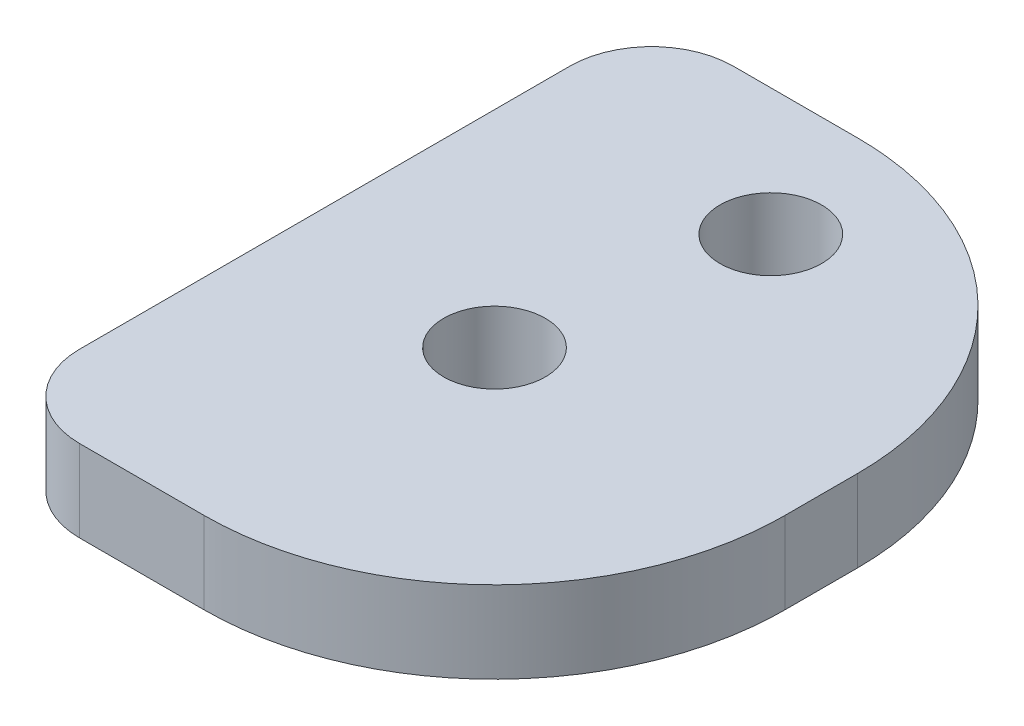
ISO-10303-21;
HEADER;
FILE_DESCRIPTION(('STEP AP214'),'2;1');
FILE_NAME('part.step','',(''),(''),'','','');
FILE_SCHEMA(('AUTOMOTIVE_DESIGN { 1 0 10303 214 1 1 1 1 }'));
ENDSEC;
DATA;
#1=APPLICATION_CONTEXT('core data for automotive mechanical design processes');
#2=APPLICATION_PROTOCOL_DEFINITION('international standard','automotive_design',2000,#1);
#3=PRODUCT_CONTEXT('',#1,'mechanical');
#4=PRODUCT('Part','Part','',(#3));
#5=PRODUCT_RELATED_PRODUCT_CATEGORY('part','',(#4));
#6=PRODUCT_DEFINITION_FORMATION('','',#4);
#7=PRODUCT_DEFINITION_CONTEXT('part definition',#1,'design');
#8=PRODUCT_DEFINITION('design','',#6,#7);
#9=PRODUCT_DEFINITION_SHAPE('','',#8);
#10=(LENGTH_UNIT() NAMED_UNIT(*) SI_UNIT(.MILLI.,.METRE.));
#11=(NAMED_UNIT(*) PLANE_ANGLE_UNIT() SI_UNIT($,.RADIAN.));
#12=(NAMED_UNIT(*) SI_UNIT($,.STERADIAN.) SOLID_ANGLE_UNIT());
#13=UNCERTAINTY_MEASURE_WITH_UNIT(LENGTH_MEASURE(1.E-05),#10,'distance_accuracy_value','');
#14=(GEOMETRIC_REPRESENTATION_CONTEXT(3) GLOBAL_UNCERTAINTY_ASSIGNED_CONTEXT((#13)) GLOBAL_UNIT_ASSIGNED_CONTEXT((#10,
#11,#12)) REPRESENTATION_CONTEXT('',''));
#15=CARTESIAN_POINT('',(0.,0.,0.));
#16=DIRECTION('',(0.,0.,1.));
#17=DIRECTION('',(1.,0.,0.));
#18=AXIS2_PLACEMENT_3D('',#15,#16,#17);
#19=CARTESIAN_POINT('',(-28.1645987316005,3.175,12.682633462926));
#20=DIRECTION('',(0.,0.,-1.));
#21=DIRECTION('',(-1.,0.,0.));
#22=AXIS2_PLACEMENT_3D('',#19,#20,#21);
#23=PLANE('',#22);
#24=DIRECTION('',(1.,0.,0.));
#25=VECTOR('',#24,1.);
#26=CARTESIAN_POINT('',(-28.1645987316005,3.175,12.682633462926));
#27=LINE('',#26,#25);
#28=CARTESIAN_POINT('',(12.1198036589627,3.175,12.682633462926));
#29=VERTEX_POINT('',#28);
#30=CARTESIAN_POINT('',(16.9458012683995,3.175,12.682633462926));
#31=VERTEX_POINT('',#30);
#32=EDGE_CURVE('E108',#29,#31,#27,.T.);
#33=ORIENTED_EDGE('',*,*,#32,.F.);
#34=DIRECTION('',(0.,1.,0.));
#35=VECTOR('',#34,1.);
#36=CARTESIAN_POINT('',(12.1198036589627,0.,12.682633462926));
#37=LINE('',#36,#35);
#38=CARTESIAN_POINT('',(12.1198036589627,0.,12.682633462926));
#39=VERTEX_POINT('',#38);
#40=EDGE_CURVE('E57',#29,#39,#37,.F.);
#41=ORIENTED_EDGE('',*,*,#40,.T.);
#42=DIRECTION('',(1.,0.,0.));
#43=VECTOR('',#42,1.);
#44=CARTESIAN_POINT('',(-28.1645987316005,0.,12.682633462926));
#45=LINE('',#44,#43);
#46=CARTESIAN_POINT('',(16.9458012683995,0.,12.682633462926));
#47=VERTEX_POINT('',#46);
#48=EDGE_CURVE('E151',#39,#47,#45,.T.);
#49=ORIENTED_EDGE('',*,*,#48,.T.);
#50=DIRECTION('',(0.,-1.,0.));
#51=VECTOR('',#50,1.);
#52=CARTESIAN_POINT('',(16.9458012683995,3.175,12.682633462926));
#53=LINE('',#52,#51);
#54=EDGE_CURVE('E162',#47,#31,#53,.F.);
#55=ORIENTED_EDGE('',*,*,#54,.T.);
#56=EDGE_LOOP('',(#33,#41,#49,#55));
#57=FACE_BOUND('',#56,.T.);
#58=ADVANCED_FACE('F34',(#57),#23,.F.);
#59=CARTESIAN_POINT('',(-28.1645987316005,3.175,-12.691966537074));
#60=DIRECTION('',(0.,0.,1.));
#61=DIRECTION('',(1.,0.,0.));
#62=AXIS2_PLACEMENT_3D('',#59,#60,#61);
#63=PLANE('',#62);
#64=DIRECTION('',(-1.,0.,0.));
#65=VECTOR('',#64,1.);
#66=CARTESIAN_POINT('',(-28.1645987316005,0.,-12.691966537074));
#67=LINE('',#66,#65);
#68=CARTESIAN_POINT('',(16.9458012683995,0.,-12.691966537074));
#69=VERTEX_POINT('',#68);
#70=CARTESIAN_POINT('',(12.1198036589627,0.,-12.691966537074));
#71=VERTEX_POINT('',#70);
#72=EDGE_CURVE('E163',#69,#71,#67,.T.);
#73=ORIENTED_EDGE('',*,*,#72,.T.);
#74=DIRECTION('',(0.,1.,0.));
#75=VECTOR('',#74,1.);
#76=CARTESIAN_POINT('',(12.1198036589627,3.175,-12.691966537074));
#77=LINE('',#76,#75);
#78=CARTESIAN_POINT('',(12.1198036589627,3.175,-12.691966537074));
#79=VERTEX_POINT('',#78);
#80=EDGE_CURVE('E11',#71,#79,#77,.T.);
#81=ORIENTED_EDGE('',*,*,#80,.T.);
#82=DIRECTION('',(-1.,0.,0.));
#83=VECTOR('',#82,1.);
#84=CARTESIAN_POINT('',(-28.1645987316005,3.175,-12.691966537074));
#85=LINE('',#84,#83);
#86=CARTESIAN_POINT('',(16.9458012683995,3.175,-12.691966537074));
#87=VERTEX_POINT('',#86);
#88=EDGE_CURVE('E123',#87,#79,#85,.T.);
#89=ORIENTED_EDGE('',*,*,#88,.F.);
#90=DIRECTION('',(0.,-1.,0.));
#91=VECTOR('',#90,1.);
#92=CARTESIAN_POINT('',(16.9458012683995,3.175,-12.691966537074));
#93=LINE('',#92,#91);
#94=EDGE_CURVE('E129',#87,#69,#93,.T.);
#95=ORIENTED_EDGE('',*,*,#94,.T.);
#96=EDGE_LOOP('',(#73,#81,#89,#95));
#97=FACE_BOUND('',#96,.T.);
#98=ADVANCED_FACE('F206',(#97),#63,.F.);
#99=CARTESIAN_POINT('',(0.0294012683994691,3.175,-0.00466653707396995));
#100=DIRECTION('',(0.,1.,0.));
#101=DIRECTION('',(0.,0.,1.));
#102=AXIS2_PLACEMENT_3D('',#99,#100,#101);
#103=PLANE('',#102);
#104=CARTESIAN_POINT('',(16.9458012683995,3.175,1.40503346292603));
#105=DIRECTION('',(0.,1.,0.));
#106=DIRECTION('',(0.,0.,1.));
#107=AXIS2_PLACEMENT_3D('',#104,#105,#106);
#108=CIRCLE('',#107,1.97358);
#109=CARTESIAN_POINT('',(16.9458012683995,3.175,3.37861346292603));
#110=VERTEX_POINT('',#109);
#111=EDGE_CURVE('E187',#110,#110,#108,.T.);
#112=ORIENTED_EDGE('',*,*,#111,.F.);
#113=EDGE_LOOP('',(#112));
#114=FACE_BOUND('',#113,.T.);
#115=CARTESIAN_POINT('',(18.4964712683995,3.175,-7.76885397433305));
#116=DIRECTION('',(0.,1.,0.));
#117=DIRECTION('',(0.,0.,1.));
#118=AXIS2_PLACEMENT_3D('',#115,#116,#117);
#119=CIRCLE('',#118,1.97358);
#120=CARTESIAN_POINT('',(18.4964712683995,3.175,-5.79527397433305));
#121=VERTEX_POINT('',#120);
#122=EDGE_CURVE('E158',#121,#121,#119,.T.);
#123=ORIENTED_EDGE('',*,*,#122,.F.);
#124=EDGE_LOOP('',(#123));
#125=FACE_BOUND('',#124,.T.);
#126=DIRECTION('',(0.,0.,1.));
#127=VECTOR('',#126,1.);
#128=CARTESIAN_POINT('',(8.9448036589627,3.175,-12.691966537074));
#129=LINE('',#128,#127);
#130=CARTESIAN_POINT('',(8.9448036589627,3.175,-9.51696653707397));
#131=VERTEX_POINT('',#130);
#132=CARTESIAN_POINT('',(8.9448036589627,3.175,9.50763346292603));
#133=VERTEX_POINT('',#132);
#134=EDGE_CURVE('E159',#131,#133,#129,.T.);
#135=ORIENTED_EDGE('',*,*,#134,.T.);
#136=CARTESIAN_POINT('',(12.1198036589627,3.175,9.50763346292603));
#137=DIRECTION('',(0.,1.,0.));
#138=DIRECTION('',(0.,0.,1.));
#139=AXIS2_PLACEMENT_3D('',#136,#137,#138);
#140=CIRCLE('',#139,3.175);
#141=EDGE_CURVE('E144',#133,#29,#140,.T.);
#142=ORIENTED_EDGE('',*,*,#141,.T.);
#143=ORIENTED_EDGE('',*,*,#32,.T.);
#144=CARTESIAN_POINT('',(16.9458012683995,3.175,12.682633462926));
#145=CARTESIAN_POINT('',(23.5520663973807,3.175,12.682633462926));
#146=CARTESIAN_POINT('',(28.2234012683995,3.175,8.01129859190721));
#147=CARTESIAN_POINT('',(28.2234012683995,3.175,1.40503346292603));
#148=(BOUNDED_CURVE() B_SPLINE_CURVE(3,(#144,#145,#146,#147),.UNSPECIFIED.,.F.,
.F.) B_SPLINE_CURVE_WITH_KNOTS((4,4),(0.,1.),
.UNSPECIFIED.) CURVE() GEOMETRIC_REPRESENTATION_ITEM() RATIONAL_B_SPLINE_CURVE((1.,
0.804737854124365,0.804737854124365,1.)) REPRESENTATION_ITEM(''));
#149=CARTESIAN_POINT('',(28.2234012683995,3.175,1.40503346292603));
#150=VERTEX_POINT('',#149);
#151=EDGE_CURVE('E102',#31,#150,#148,.T.);
#152=ORIENTED_EDGE('',*,*,#151,.T.);
#153=DIRECTION('',(0.,0.,-1.));
#154=VECTOR('',#153,1.);
#155=CARTESIAN_POINT('',(28.2234012683995,3.175,-12.691966537074));
#156=LINE('',#155,#154);
#157=CARTESIAN_POINT('',(28.2234012683995,3.175,-1.41436653707397));
#158=VERTEX_POINT('',#157);
#159=EDGE_CURVE('E106',#150,#158,#156,.T.);
#160=ORIENTED_EDGE('',*,*,#159,.T.);
#161=CARTESIAN_POINT('',(28.2234012683995,3.175,-1.41436653707397));
#162=CARTESIAN_POINT('',(28.2234012683995,3.175,-8.02063166605515));
#163=CARTESIAN_POINT('',(23.5520663973807,3.175,-12.691966537074));
#164=CARTESIAN_POINT('',(16.9458012683995,3.175,-12.691966537074));
#165=(BOUNDED_CURVE() B_SPLINE_CURVE(3,(#161,#162,#163,#164),.UNSPECIFIED.,.F.,
.F.) B_SPLINE_CURVE_WITH_KNOTS((4,4),(0.,1.),
.UNSPECIFIED.) CURVE() GEOMETRIC_REPRESENTATION_ITEM() RATIONAL_B_SPLINE_CURVE((1.,
0.804737854124365,0.804737854124365,1.)) REPRESENTATION_ITEM(''));
#166=EDGE_CURVE('E136',#158,#87,#165,.T.);
#167=ORIENTED_EDGE('',*,*,#166,.T.);
#168=ORIENTED_EDGE('',*,*,#88,.T.);
#169=CARTESIAN_POINT('',(12.1198036589627,3.175,-9.51696653707397));
#170=DIRECTION('',(0.,1.,0.));
#171=DIRECTION('',(0.,0.,1.));
#172=AXIS2_PLACEMENT_3D('',#169,#170,#171);
#173=CIRCLE('',#172,3.175);
#174=EDGE_CURVE('E142',#79,#131,#173,.T.);
#175=ORIENTED_EDGE('',*,*,#174,.T.);
#176=EDGE_LOOP('',(#135,#142,#143,#152,#160,#167,#168,#175));
#177=FACE_BOUND('',#176,.T.);
#178=ADVANCED_FACE('F105',(#114,#125,#177),#103,.T.);
#179=CARTESIAN_POINT('',(0.0294012683994691,0.,-0.00466653707396995));
#180=DIRECTION('',(0.,1.,0.));
#181=DIRECTION('',(0.,0.,1.));
#182=AXIS2_PLACEMENT_3D('',#179,#180,#181);
#183=PLANE('',#182);
#184=CARTESIAN_POINT('',(16.9458012683995,0.,1.40503346292603));
#185=DIRECTION('',(0.,1.,0.));
#186=DIRECTION('',(0.,0.,1.));
#187=AXIS2_PLACEMENT_3D('',#184,#185,#186);
#188=CIRCLE('',#187,1.97358);
#189=CARTESIAN_POINT('',(16.9458012683995,0.,3.37861346292603));
#190=VERTEX_POINT('',#189);
#191=EDGE_CURVE('E182',#190,#190,#188,.T.);
#192=ORIENTED_EDGE('',*,*,#191,.T.);
#193=EDGE_LOOP('',(#192));
#194=FACE_BOUND('',#193,.T.);
#195=CARTESIAN_POINT('',(18.4964712683995,0.,-7.76885397433305));
#196=DIRECTION('',(0.,1.,0.));
#197=DIRECTION('',(0.,0.,1.));
#198=AXIS2_PLACEMENT_3D('',#195,#196,#197);
#199=CIRCLE('',#198,1.97358);
#200=CARTESIAN_POINT('',(18.4964712683995,0.,-5.79527397433305));
#201=VERTEX_POINT('',#200);
#202=EDGE_CURVE('E184',#201,#201,#199,.T.);
#203=ORIENTED_EDGE('',*,*,#202,.T.);
#204=EDGE_LOOP('',(#203));
#205=FACE_BOUND('',#204,.T.);
#206=ORIENTED_EDGE('',*,*,#48,.F.);
#207=CARTESIAN_POINT('',(12.1198036589627,0.,9.50763346292603));
#208=DIRECTION('',(0.,1.,0.));
#209=DIRECTION('',(0.,0.,1.));
#210=AXIS2_PLACEMENT_3D('',#207,#208,#209);
#211=CIRCLE('',#210,3.175);
#212=CARTESIAN_POINT('',(8.9448036589627,0.,9.50763346292603));
#213=VERTEX_POINT('',#212);
#214=EDGE_CURVE('E42',#39,#213,#211,.F.);
#215=ORIENTED_EDGE('',*,*,#214,.T.);
#216=DIRECTION('',(0.,0.,1.));
#217=VECTOR('',#216,1.);
#218=CARTESIAN_POINT('',(8.9448036589627,0.,-12.691966537074));
#219=LINE('',#218,#217);
#220=CARTESIAN_POINT('',(8.9448036589627,0.,-9.51696653707397));
#221=VERTEX_POINT('',#220);
#222=EDGE_CURVE('E150',#221,#213,#219,.T.);
#223=ORIENTED_EDGE('',*,*,#222,.F.);
#224=CARTESIAN_POINT('',(12.1198036589627,0.,-9.51696653707397));
#225=DIRECTION('',(0.,1.,0.));
#226=DIRECTION('',(0.,0.,1.));
#227=AXIS2_PLACEMENT_3D('',#224,#225,#226);
#228=CIRCLE('',#227,3.175);
#229=EDGE_CURVE('E49',#221,#71,#228,.F.);
#230=ORIENTED_EDGE('',*,*,#229,.T.);
#231=ORIENTED_EDGE('',*,*,#72,.F.);
#232=CARTESIAN_POINT('',(28.2234012683995,0.,-1.41436653707397));
#233=CARTESIAN_POINT('',(28.2234012683995,0.,-8.02063166605515));
#234=CARTESIAN_POINT('',(23.5520663973807,0.,-12.691966537074));
#235=CARTESIAN_POINT('',(16.9458012683995,0.,-12.691966537074));
#236=(BOUNDED_CURVE() B_SPLINE_CURVE(3,(#232,#233,#234,#235),.UNSPECIFIED.,.F.,
.F.) B_SPLINE_CURVE_WITH_KNOTS((4,4),(0.,1.),
.UNSPECIFIED.) CURVE() GEOMETRIC_REPRESENTATION_ITEM() RATIONAL_B_SPLINE_CURVE((1.,
0.804737854124365,0.804737854124365,1.)) REPRESENTATION_ITEM(''));
#237=CARTESIAN_POINT('',(28.2234012683995,0.,-1.41436653707397));
#238=VERTEX_POINT('',#237);
#239=EDGE_CURVE('E127',#69,#238,#236,.F.);
#240=ORIENTED_EDGE('',*,*,#239,.T.);
#241=DIRECTION('',(0.,0.,-1.));
#242=VECTOR('',#241,1.);
#243=CARTESIAN_POINT('',(28.2234012683995,0.,-12.691966537074));
#244=LINE('',#243,#242);
#245=CARTESIAN_POINT('',(28.2234012683995,0.,1.40503346292603));
#246=VERTEX_POINT('',#245);
#247=EDGE_CURVE('E165',#246,#238,#244,.T.);
#248=ORIENTED_EDGE('',*,*,#247,.F.);
#249=CARTESIAN_POINT('',(16.9458012683995,0.,12.682633462926));
#250=CARTESIAN_POINT('',(23.5520663973807,0.,12.682633462926));
#251=CARTESIAN_POINT('',(28.2234012683995,0.,8.01129859190721));
#252=CARTESIAN_POINT('',(28.2234012683995,0.,1.40503346292603));
#253=(BOUNDED_CURVE() B_SPLINE_CURVE(3,(#249,#250,#251,#252),.UNSPECIFIED.,.F.,
.F.) B_SPLINE_CURVE_WITH_KNOTS((4,4),(0.,1.),
.UNSPECIFIED.) CURVE() GEOMETRIC_REPRESENTATION_ITEM() RATIONAL_B_SPLINE_CURVE((1.,
0.804737854124365,0.804737854124365,1.)) REPRESENTATION_ITEM(''));
#254=EDGE_CURVE('E114',#246,#47,#253,.F.);
#255=ORIENTED_EDGE('',*,*,#254,.T.);
#256=EDGE_LOOP('',(#206,#215,#223,#230,#231,#240,#248,#255));
#257=FACE_BOUND('',#256,.T.);
#258=ADVANCED_FACE('F149',(#194,#205,#257),#183,.F.);
#259=CARTESIAN_POINT('',(28.2234012683995,3.175,-12.691966537074));
#260=DIRECTION('',(-1.,0.,0.));
#261=DIRECTION('',(0.,0.,1.));
#262=AXIS2_PLACEMENT_3D('',#259,#260,#261);
#263=PLANE('',#262);
#264=ORIENTED_EDGE('',*,*,#247,.T.);
#265=DIRECTION('',(0.,-1.,0.));
#266=VECTOR('',#265,1.);
#267=CARTESIAN_POINT('',(28.2234012683995,3.175,-1.41436653707397));
#268=LINE('',#267,#266);
#269=EDGE_CURVE('E122',#238,#158,#268,.F.);
#270=ORIENTED_EDGE('',*,*,#269,.T.);
#271=ORIENTED_EDGE('',*,*,#159,.F.);
#272=DIRECTION('',(0.,-1.,0.));
#273=VECTOR('',#272,1.);
#274=CARTESIAN_POINT('',(28.2234012683995,3.175,1.40503346292603));
#275=LINE('',#274,#273);
#276=EDGE_CURVE('E113',#150,#246,#275,.T.);
#277=ORIENTED_EDGE('',*,*,#276,.T.);
#278=EDGE_LOOP('',(#264,#270,#271,#277));
#279=FACE_BOUND('',#278,.T.);
#280=ADVANCED_FACE('F119',(#279),#263,.F.);
#281=CARTESIAN_POINT('',(16.9458012683995,3.175,1.40503346292603));
#282=DIRECTION('',(0.,-1.,0.));
#283=DIRECTION('',(0.,0.,-1.));
#284=AXIS2_PLACEMENT_3D('',#281,#282,#283);
#285=CYLINDRICAL_SURFACE('',#284,11.2776);
#286=ORIENTED_EDGE('',*,*,#151,.F.);
#287=ORIENTED_EDGE('',*,*,#54,.F.);
#288=ORIENTED_EDGE('',*,*,#254,.F.);
#289=ORIENTED_EDGE('',*,*,#276,.F.);
#290=EDGE_LOOP('',(#286,#287,#288,#289));
#291=FACE_BOUND('',#290,.T.);
#292=ADVANCED_FACE('F125',(#291),#285,.T.);
#293=CARTESIAN_POINT('',(16.9458012683995,0.,1.40503346292603));
#294=DIRECTION('',(0.,1.,0.));
#295=DIRECTION('',(0.,0.,1.));
#296=AXIS2_PLACEMENT_3D('',#293,#294,#295);
#297=CYLINDRICAL_SURFACE('',#296,1.97358);
#298=ORIENTED_EDGE('',*,*,#191,.F.);
#299=EDGE_LOOP('',(#298));
#300=FACE_BOUND('',#299,.T.);
#301=ORIENTED_EDGE('',*,*,#111,.T.);
#302=EDGE_LOOP('',(#301));
#303=FACE_BOUND('',#302,.T.);
#304=ADVANCED_FACE('F215',(#300,#303),#297,.F.);
#305=CARTESIAN_POINT('',(18.4964712683995,0.,-7.76885397433305));
#306=DIRECTION('',(0.,1.,0.));
#307=DIRECTION('',(0.,0.,1.));
#308=AXIS2_PLACEMENT_3D('',#305,#306,#307);
#309=CYLINDRICAL_SURFACE('',#308,1.97358);
#310=ORIENTED_EDGE('',*,*,#202,.F.);
#311=EDGE_LOOP('',(#310));
#312=FACE_BOUND('',#311,.T.);
#313=ORIENTED_EDGE('',*,*,#122,.T.);
#314=EDGE_LOOP('',(#313));
#315=FACE_BOUND('',#314,.T.);
#316=ADVANCED_FACE('F222',(#312,#315),#309,.F.);
#317=CARTESIAN_POINT('',(16.9458012683995,3.175,-1.41436653707397));
#318=DIRECTION('',(0.,-1.,0.));
#319=DIRECTION('',(0.,0.,-1.));
#320=AXIS2_PLACEMENT_3D('',#317,#318,#319);
#321=CYLINDRICAL_SURFACE('',#320,11.2776);
#322=ORIENTED_EDGE('',*,*,#166,.F.);
#323=ORIENTED_EDGE('',*,*,#269,.F.);
#324=ORIENTED_EDGE('',*,*,#239,.F.);
#325=ORIENTED_EDGE('',*,*,#94,.F.);
#326=EDGE_LOOP('',(#322,#323,#324,#325));
#327=FACE_BOUND('',#326,.T.);
#328=ADVANCED_FACE('F201',(#327),#321,.T.);
#329=CARTESIAN_POINT('',(8.9448036589627,0.,-12.691966537074));
#330=DIRECTION('',(-1.,0.,0.));
#331=DIRECTION('',(0.,0.,1.));
#332=AXIS2_PLACEMENT_3D('',#329,#330,#331);
#333=PLANE('',#332);
#334=ORIENTED_EDGE('',*,*,#222,.T.);
#335=DIRECTION('',(0.,1.,0.));
#336=VECTOR('',#335,1.);
#337=CARTESIAN_POINT('',(8.9448036589627,3.175,9.50763346292603));
#338=LINE('',#337,#336);
#339=EDGE_CURVE('E139',#213,#133,#338,.T.);
#340=ORIENTED_EDGE('',*,*,#339,.T.);
#341=ORIENTED_EDGE('',*,*,#134,.F.);
#342=DIRECTION('',(0.,1.,0.));
#343=VECTOR('',#342,1.);
#344=CARTESIAN_POINT('',(8.9448036589627,0.,-9.51696653707397));
#345=LINE('',#344,#343);
#346=EDGE_CURVE('E137',#131,#221,#345,.F.);
#347=ORIENTED_EDGE('',*,*,#346,.T.);
#348=EDGE_LOOP('',(#334,#340,#341,#347));
#349=FACE_BOUND('',#348,.T.);
#350=ADVANCED_FACE('F155',(#349),#333,.T.);
#351=CARTESIAN_POINT('',(12.1198036589627,0.,9.50763346292603));
#352=DIRECTION('',(0.,-1.,0.));
#353=DIRECTION('',(0.,0.,-1.));
#354=AXIS2_PLACEMENT_3D('',#351,#352,#353);
#355=CYLINDRICAL_SURFACE('',#354,3.175);
#356=ORIENTED_EDGE('',*,*,#214,.F.);
#357=ORIENTED_EDGE('',*,*,#40,.F.);
#358=ORIENTED_EDGE('',*,*,#141,.F.);
#359=ORIENTED_EDGE('',*,*,#339,.F.);
#360=EDGE_LOOP('',(#356,#357,#358,#359));
#361=FACE_BOUND('',#360,.T.);
#362=ADVANCED_FACE('F161',(#361),#355,.T.);
#363=CARTESIAN_POINT('',(12.1198036589627,3.175,-9.51696653707397));
#364=DIRECTION('',(0.,-1.,0.));
#365=DIRECTION('',(0.,0.,-1.));
#366=AXIS2_PLACEMENT_3D('',#363,#364,#365);
#367=CYLINDRICAL_SURFACE('',#366,3.175);
#368=ORIENTED_EDGE('',*,*,#229,.F.);
#369=ORIENTED_EDGE('',*,*,#346,.F.);
#370=ORIENTED_EDGE('',*,*,#174,.F.);
#371=ORIENTED_EDGE('',*,*,#80,.F.);
#372=EDGE_LOOP('',(#368,#369,#370,#371));
#373=FACE_BOUND('',#372,.T.);
#374=ADVANCED_FACE('F36',(#373),#367,.T.);
#375=CLOSED_SHELL('',(#58,#98,#178,#258,#280,#292,#304,#316,#328,#350,#362,#374));
#376=MANIFOLD_SOLID_BREP('B2',#375);
#377=ADVANCED_BREP_SHAPE_REPRESENTATION('',(#18,#376),#14);
#378=SHAPE_DEFINITION_REPRESENTATION(#9,#377);
ENDSEC;
END-ISO-10303-21;
